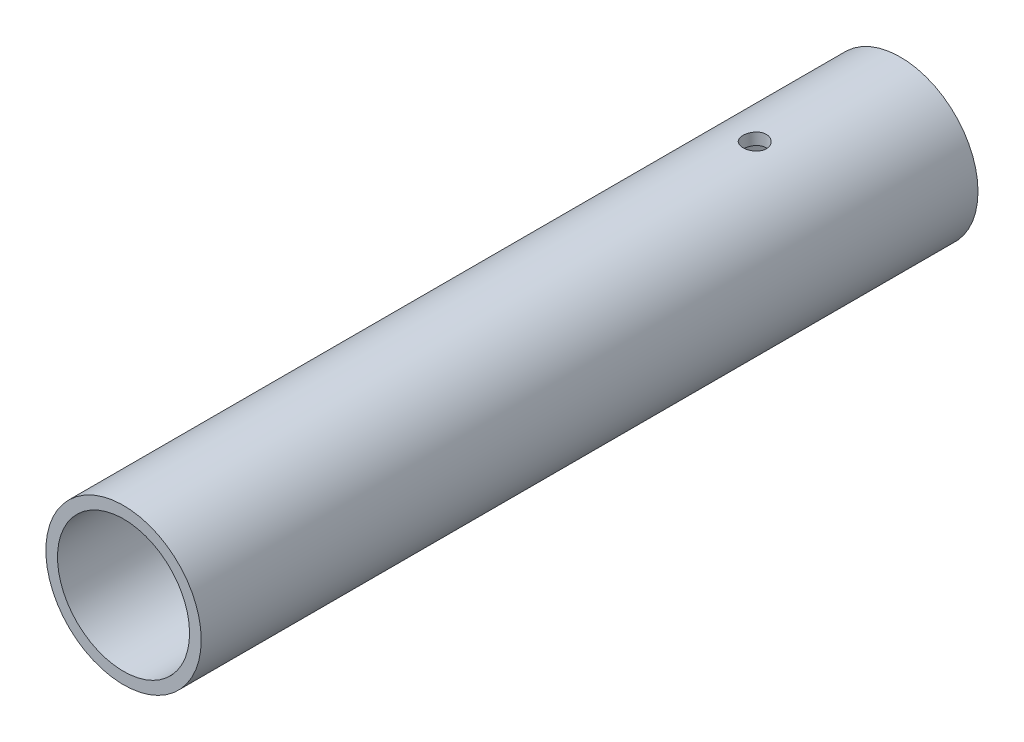
ISO-10303-21;
HEADER;
FILE_DESCRIPTION(('STEP AP214'),'2;1');
FILE_NAME('part.step','',(''),(''),'','','');
FILE_SCHEMA(('AUTOMOTIVE_DESIGN { 1 0 10303 214 1 1 1 1 }'));
ENDSEC;
DATA;
#1=APPLICATION_CONTEXT('core data for automotive mechanical design processes');
#2=APPLICATION_PROTOCOL_DEFINITION('international standard','automotive_design',2000,#1);
#3=PRODUCT_CONTEXT('',#1,'mechanical');
#4=PRODUCT('Part','Part','',(#3));
#5=PRODUCT_RELATED_PRODUCT_CATEGORY('part','',(#4));
#6=PRODUCT_DEFINITION_FORMATION('','',#4);
#7=PRODUCT_DEFINITION_CONTEXT('part definition',#1,'design');
#8=PRODUCT_DEFINITION('design','',#6,#7);
#9=PRODUCT_DEFINITION_SHAPE('','',#8);
#10=(LENGTH_UNIT() NAMED_UNIT(*) SI_UNIT(.MILLI.,.METRE.));
#11=(NAMED_UNIT(*) PLANE_ANGLE_UNIT() SI_UNIT($,.RADIAN.));
#12=(NAMED_UNIT(*) SI_UNIT($,.STERADIAN.) SOLID_ANGLE_UNIT());
#13=UNCERTAINTY_MEASURE_WITH_UNIT(LENGTH_MEASURE(1.E-05),#10,'distance_accuracy_value','');
#14=(GEOMETRIC_REPRESENTATION_CONTEXT(3) GLOBAL_UNCERTAINTY_ASSIGNED_CONTEXT((#13)) GLOBAL_UNIT_ASSIGNED_CONTEXT((#10,
#11,#12)) REPRESENTATION_CONTEXT('',''));
#15=CARTESIAN_POINT('',(0.,0.,0.));
#16=DIRECTION('',(0.,0.,1.));
#17=DIRECTION('',(1.,0.,0.));
#18=AXIS2_PLACEMENT_3D('',#15,#16,#17);
#19=CARTESIAN_POINT('',(0.,0.,100.));
#20=DIRECTION('',(0.,0.,1.));
#21=DIRECTION('',(1.,0.,0.));
#22=AXIS2_PLACEMENT_3D('',#19,#20,#21);
#23=PLANE('',#22);
#24=CARTESIAN_POINT('',(0.,0.,100.));
#25=DIRECTION('',(0.,0.,1.));
#26=DIRECTION('',(1.,0.,0.));
#27=AXIS2_PLACEMENT_3D('',#24,#25,#26);
#28=CIRCLE('',#27,20.);
#29=CARTESIAN_POINT('',(20.,0.,100.));
#30=VERTEX_POINT('',#29);
#31=EDGE_CURVE('E10',#30,#30,#28,.T.);
#32=ORIENTED_EDGE('',*,*,#31,.T.);
#33=EDGE_LOOP('',(#32));
#34=FACE_BOUND('',#33,.T.);
#35=CARTESIAN_POINT('',(0.,0.,100.));
#36=DIRECTION('',(0.,0.,1.));
#37=DIRECTION('',(1.,0.,0.));
#38=AXIS2_PLACEMENT_3D('',#35,#36,#37);
#39=CIRCLE('',#38,17.);
#40=CARTESIAN_POINT('',(17.,0.,100.));
#41=VERTEX_POINT('',#40);
#42=EDGE_CURVE('E58',#41,#41,#39,.T.);
#43=ORIENTED_EDGE('',*,*,#42,.F.);
#44=EDGE_LOOP('',(#43));
#45=FACE_BOUND('',#44,.T.);
#46=ADVANCED_FACE('F37',(#34,#45),#23,.T.);
#47=CARTESIAN_POINT('',(0.,0.,-100.));
#48=DIRECTION('',(0.,0.,1.));
#49=DIRECTION('',(1.,0.,0.));
#50=AXIS2_PLACEMENT_3D('',#47,#48,#49);
#51=PLANE('',#50);
#52=CARTESIAN_POINT('',(0.,0.,-100.));
#53=DIRECTION('',(0.,0.,1.));
#54=DIRECTION('',(1.,0.,0.));
#55=AXIS2_PLACEMENT_3D('',#52,#53,#54);
#56=CIRCLE('',#55,20.);
#57=CARTESIAN_POINT('',(20.,0.,-100.));
#58=VERTEX_POINT('',#57);
#59=EDGE_CURVE('E52',#58,#58,#56,.T.);
#60=ORIENTED_EDGE('',*,*,#59,.F.);
#61=EDGE_LOOP('',(#60));
#62=FACE_BOUND('',#61,.T.);
#63=CARTESIAN_POINT('',(0.,0.,-100.));
#64=DIRECTION('',(0.,0.,1.));
#65=DIRECTION('',(1.,0.,0.));
#66=AXIS2_PLACEMENT_3D('',#63,#64,#65);
#67=CIRCLE('',#66,17.);
#68=CARTESIAN_POINT('',(17.,0.,-100.));
#69=VERTEX_POINT('',#68);
#70=EDGE_CURVE('E61',#69,#69,#67,.T.);
#71=ORIENTED_EDGE('',*,*,#70,.T.);
#72=EDGE_LOOP('',(#71));
#73=FACE_BOUND('',#72,.T.);
#74=ADVANCED_FACE('F102',(#62,#73),#51,.F.);
#75=CARTESIAN_POINT('',(0.,0.,100.));
#76=DIRECTION('',(0.,0.,-1.));
#77=DIRECTION('',(-1.,0.,0.));
#78=AXIS2_PLACEMENT_3D('',#75,#76,#77);
#79=CYLINDRICAL_SURFACE('',#78,20.);
#80=CARTESIAN_POINT('',(0.,-20.,-59.5));
#81=CARTESIAN_POINT('',(0.167503088963284,-19.9999973154259,-59.5000069076305));
#82=CARTESIAN_POINT('',(0.335103370164264,-19.9978736507408,-59.5140760016813));
#83=CARTESIAN_POINT('',(0.665619255989826,-19.9896063194637,-59.5699663999655));
#84=CARTESIAN_POINT('',(0.828530137948457,-19.9834587387695,-59.6118147258898));
#85=CARTESIAN_POINT('',(1.14483617244372,-19.9678344243905,-59.7219850099352));
#86=CARTESIAN_POINT('',(1.2982384156536,-19.9583602074184,-59.7902869590119));
#87=CARTESIAN_POINT('',(1.59138085727051,-19.9371295182345,-59.9513767588337));
#88=CARTESIAN_POINT('',(1.73112294945038,-19.9253733630554,-60.0441612088347));
#89=CARTESIAN_POINT('',(1.99409343912425,-19.900783419829,-60.2523545298798));
#90=CARTESIAN_POINT('',(2.117199664451,-19.8879426778066,-60.3679169124164));
#91=CARTESIAN_POINT('',(2.34234981337897,-19.8626852226648,-60.6180553777877));
#92=CARTESIAN_POINT('',(2.44439252545871,-19.8502685339701,-60.752632553557));
#93=CARTESIAN_POINT('',(2.62499458999886,-19.8271975491745,-61.037801287045));
#94=CARTESIAN_POINT('',(2.7034357407441,-19.8165522395006,-61.1884684939627));
#95=CARTESIAN_POINT('',(2.83385264342112,-19.7983242261253,-61.5010256412908));
#96=CARTESIAN_POINT('',(2.88582983778326,-19.790741355509,-61.6629149694878));
#97=CARTESIAN_POINT('',(2.96146397597822,-19.7795651243735,-61.9920360837434));
#98=CARTESIAN_POINT('',(2.98533007281035,-19.775942314825,-62.159218786816));
#99=CARTESIAN_POINT('',(3.00471248067865,-19.7730069794116,-62.4952523319745));
#100=CARTESIAN_POINT('',(3.00023041947592,-19.7736942060629,-62.664103077725));
#101=CARTESIAN_POINT('',(2.96321466501575,-19.7792743670482,-62.9972021603883));
#102=CARTESIAN_POINT('',(2.93091391855501,-19.784132375231,-63.1614770529696));
#103=CARTESIAN_POINT('',(2.83954234807469,-19.7974521625273,-63.482248737743));
#104=CARTESIAN_POINT('',(2.78047076675625,-19.8059140435876,-63.6387453097615));
#105=CARTESIAN_POINT('',(2.63699207059473,-19.8255267109096,-63.9402267425657));
#106=CARTESIAN_POINT('',(2.55248628566396,-19.8366879353305,-64.0851639381848));
#107=CARTESIAN_POINT('',(2.3606082625791,-19.8604341514909,-64.3588891915639));
#108=CARTESIAN_POINT('',(2.25323452364956,-19.87301923665,-64.4876761885387));
#109=CARTESIAN_POINT('',(2.01738986156496,-19.8983494611242,-64.7267953214794));
#110=CARTESIAN_POINT('',(1.88871865928401,-19.9110949422563,-64.8369299805727));
#111=CARTESIAN_POINT('',(1.61461417978838,-19.9351929529692,-65.0340718690145));
#112=CARTESIAN_POINT('',(1.46918082917634,-19.9465454764502,-65.1210789970878));
#113=CARTESIAN_POINT('',(1.16550919642737,-19.9665903117079,-65.2695061729991));
#114=CARTESIAN_POINT('',(1.00726335567356,-19.9752810385085,-65.3309109836806));
#115=CARTESIAN_POINT('',(0.682546364974125,-19.9890098111414,-65.4262187793708));
#116=CARTESIAN_POINT('',(0.516075771905205,-19.9940481039093,-65.4601236236312));
#117=CARTESIAN_POINT('',(0.181339135287298,-19.9998716226774,-65.4992064596334));
#118=CARTESIAN_POINT('',(0.0131054637409462,-20.0006970418078,-65.5046559427586));
#119=CARTESIAN_POINT('',(-0.321873355324562,-19.9981112203045,-65.4873939893779));
#120=CARTESIAN_POINT('',(-0.488618548763752,-19.9947001108274,-65.4646834246638));
#121=CARTESIAN_POINT('',(-0.815064774862814,-19.9840493723067,-65.3919717996449));
#122=CARTESIAN_POINT('',(-0.974795926159673,-19.9768283041597,-65.3421030079383));
#123=CARTESIAN_POINT('',(-1.283629917286,-19.9593647131674,-65.2166300050765));
#124=CARTESIAN_POINT('',(-1.4327322575902,-19.9491220484313,-65.1410245853327));
#125=CARTESIAN_POINT('',(-1.71726995858385,-19.9266536493737,-64.9655875508723));
#126=CARTESIAN_POINT('',(-1.85259801978314,-19.9144140325349,-64.8655837199745));
#127=CARTESIAN_POINT('',(-2.10464734635542,-19.8893572602433,-64.6444283767425));
#128=CARTESIAN_POINT('',(-2.22136752958681,-19.8765400712573,-64.5232756353507));
#129=CARTESIAN_POINT('',(-2.43387569914391,-19.8516452860899,-64.262052933647));
#130=CARTESIAN_POINT('',(-2.52948169494843,-19.8395747203518,-64.1218341496105));
#131=CARTESIAN_POINT('',(-2.69578258541168,-19.8176643820981,-63.8271679189765));
#132=CARTESIAN_POINT('',(-2.76647815312872,-19.8078245493126,-63.6727208569571));
#133=CARTESIAN_POINT('',(-2.88066934647887,-19.7915406601729,-63.3545249327537));
#134=CARTESIAN_POINT('',(-2.92426074283271,-19.7850846601288,-63.1908110780575));
#135=CARTESIAN_POINT('',(-2.98331099003173,-19.776267645956,-62.8582819691298));
#136=CARTESIAN_POINT('',(-2.99877178366133,-19.7739063490354,-62.6894670680107));
#137=CARTESIAN_POINT('',(-3.0010757333888,-19.7735566522168,-62.3533418733684));
#138=CARTESIAN_POINT('',(-2.98820504334626,-19.77552452667,-62.1860335164862));
#139=CARTESIAN_POINT('',(-2.93482459088758,-19.7835164122235,-61.855989473353));
#140=CARTESIAN_POINT('',(-2.89431487277254,-19.7895404168223,-61.6932537797732));
#141=CARTESIAN_POINT('',(-2.7869074703733,-19.8049505222459,-61.3770538355314));
#142=CARTESIAN_POINT('',(-2.72002978648628,-19.8143340743215,-61.2235826591331));
#143=CARTESIAN_POINT('',(-2.56181335284618,-19.835409091154,-60.9299927323952));
#144=CARTESIAN_POINT('',(-2.47047377483004,-19.8471006340545,-60.7898744343927));
#145=CARTESIAN_POINT('',(-2.26488675318328,-19.8716148672988,-60.5255138840497));
#146=CARTESIAN_POINT('',(-2.15042738079611,-19.8844473576393,-60.4014373335059));
#147=CARTESIAN_POINT('',(-1.90229768216567,-19.9097157765327,-60.1741508904244));
#148=CARTESIAN_POINT('',(-1.76862289670188,-19.9221516122152,-60.0709458548477));
#149=CARTESIAN_POINT('',(-1.48499141508744,-19.9453037158104,-59.8878246467853));
#150=CARTESIAN_POINT('',(-1.33494915352952,-19.9560101425764,-59.8080397815705));
#151=CARTESIAN_POINT('',(-1.02350374049744,-19.9744005760592,-59.6749229664839));
#152=CARTESIAN_POINT('',(-0.86211255419341,-19.9820877113151,-59.6215636198926));
#153=CARTESIAN_POINT('',(-0.583331455778659,-19.9918187852301,-59.5549173145798));
#154=CARTESIAN_POINT('',(-0.467662266990557,-19.9948709835911,-59.5343547969224));
#155=CARTESIAN_POINT('',(-0.23467794320025,-19.9989625189579,-59.5068938045747));
#156=CARTESIAN_POINT('',(-0.117362828668834,-20.0000018809755,-59.4999951600949));
#157=CARTESIAN_POINT('',(0.,-20.,-59.5));
#158=B_SPLINE_CURVE_WITH_KNOTS('',3,(#80,#81,#82,#83,#84,#85,#86,#87,#88,#89,#90,#91,#92,#93,
#94,#95,#96,#97,#98,#99,#100,#101,#102,#103,#104,#105,#106,#107,#108,#109,#110,#111,#112,#113,
#114,#115,#116,#117,#118,#119,#120,#121,#122,#123,#124,#125,#126,#127,#128,#129,#130,#131,#132,
#133,#134,#135,#136,#137,#138,#139,#140,#141,#142,#143,#144,#145,#146,#147,#148,#149,#150,#151,
#152,#153,#154,#155,#156,#157),.UNSPECIFIED.,.T.,.F.,(4,2,2,2,2,2,2,2,2,2,2,2,2,2,2,2,2,2,2,2,2,
2,2,2,2,2,2,2,2,2,2,2,2,2,2,2,2,2,4),(0.,0.502080410063326,1.0046499258583,1.50684004716647,
2.0089604483952,2.51458832273687,3.0202452714516,3.5283940479075,4.03651512451011,
4.54083129211848,5.04511850197965,5.54522354391492,6.04534273380722,6.54742766952317,
7.04954556617068,7.55668582510817,8.06382830477336,8.57127217969749,9.07868174386802,
9.5812411708851,10.0837850398231,10.583902979319,11.0840444075255,11.5878237607382,
12.0916324005726,12.5996273316934,13.1076085361766,13.6137844691434,14.1199254427435,
14.6209777652213,15.1220292845913,15.6227014796829,16.1233906293376,16.6288965993144,
17.1345200693747,17.6429264676947,18.1508046652288,18.5025970395762,18.8543850424658),.UNSPECIFIED.);
#159=CARTESIAN_POINT('',(0.,-20.,-59.5));
#160=VERTEX_POINT('',#159);
#161=EDGE_CURVE('E88',#160,#160,#158,.T.);
#162=ORIENTED_EDGE('',*,*,#161,.T.);
#163=EDGE_LOOP('',(#162));
#164=FACE_BOUND('',#163,.T.);
#165=CARTESIAN_POINT('',(0.,20.,-59.5));
#166=CARTESIAN_POINT('',(-0.167503088963284,19.9999973154259,-59.5000069076305));
#167=CARTESIAN_POINT('',(-0.335103370164264,19.9978736507408,-59.5140760016813));
#168=CARTESIAN_POINT('',(-0.665619255989826,19.9896063194637,-59.5699663999655));
#169=CARTESIAN_POINT('',(-0.828530137948457,19.9834587387695,-59.6118147258898));
#170=CARTESIAN_POINT('',(-1.14483617244372,19.9678344243905,-59.7219850099352));
#171=CARTESIAN_POINT('',(-1.2982384156536,19.9583602074184,-59.7902869590119));
#172=CARTESIAN_POINT('',(-1.59138085727051,19.9371295182345,-59.9513767588337));
#173=CARTESIAN_POINT('',(-1.73112294945038,19.9253733630554,-60.0441612088347));
#174=CARTESIAN_POINT('',(-1.99409343912425,19.900783419829,-60.2523545298798));
#175=CARTESIAN_POINT('',(-2.117199664451,19.8879426778066,-60.3679169124164));
#176=CARTESIAN_POINT('',(-2.34234981337897,19.8626852226648,-60.6180553777877));
#177=CARTESIAN_POINT('',(-2.44439252545871,19.8502685339701,-60.752632553557));
#178=CARTESIAN_POINT('',(-2.62499458999886,19.8271975491745,-61.037801287045));
#179=CARTESIAN_POINT('',(-2.7034357407441,19.8165522395006,-61.1884684939627));
#180=CARTESIAN_POINT('',(-2.83385264342112,19.7983242261253,-61.5010256412908));
#181=CARTESIAN_POINT('',(-2.88582983778326,19.790741355509,-61.6629149694878));
#182=CARTESIAN_POINT('',(-2.96146397597822,19.7795651243735,-61.9920360837434));
#183=CARTESIAN_POINT('',(-2.98533007281035,19.775942314825,-62.159218786816));
#184=CARTESIAN_POINT('',(-3.00471248067865,19.7730069794116,-62.4952523319745));
#185=CARTESIAN_POINT('',(-3.00023041947592,19.7736942060629,-62.664103077725));
#186=CARTESIAN_POINT('',(-2.96321466501575,19.7792743670482,-62.9972021603883));
#187=CARTESIAN_POINT('',(-2.93091391855501,19.784132375231,-63.1614770529696));
#188=CARTESIAN_POINT('',(-2.83954234807469,19.7974521625273,-63.482248737743));
#189=CARTESIAN_POINT('',(-2.78047076675625,19.8059140435876,-63.6387453097615));
#190=CARTESIAN_POINT('',(-2.63699207059473,19.8255267109096,-63.9402267425657));
#191=CARTESIAN_POINT('',(-2.55248628566396,19.8366879353305,-64.0851639381848));
#192=CARTESIAN_POINT('',(-2.3606082625791,19.8604341514909,-64.3588891915639));
#193=CARTESIAN_POINT('',(-2.25323452364956,19.87301923665,-64.4876761885387));
#194=CARTESIAN_POINT('',(-2.01738986156496,19.8983494611242,-64.7267953214794));
#195=CARTESIAN_POINT('',(-1.88871865928401,19.9110949422563,-64.8369299805727));
#196=CARTESIAN_POINT('',(-1.61461417978838,19.9351929529692,-65.0340718690145));
#197=CARTESIAN_POINT('',(-1.46918082917634,19.9465454764502,-65.1210789970878));
#198=CARTESIAN_POINT('',(-1.16550919642737,19.9665903117079,-65.2695061729991));
#199=CARTESIAN_POINT('',(-1.00726335567356,19.9752810385085,-65.3309109836806));
#200=CARTESIAN_POINT('',(-0.682546364974125,19.9890098111414,-65.4262187793708));
#201=CARTESIAN_POINT('',(-0.516075771905205,19.9940481039093,-65.4601236236312));
#202=CARTESIAN_POINT('',(-0.181339135287298,19.9998716226774,-65.4992064596334));
#203=CARTESIAN_POINT('',(-0.0131054637409462,20.0006970418078,-65.5046559427586));
#204=CARTESIAN_POINT('',(0.321873355324562,19.9981112203045,-65.4873939893779));
#205=CARTESIAN_POINT('',(0.488618548763752,19.9947001108274,-65.4646834246638));
#206=CARTESIAN_POINT('',(0.815064774862814,19.9840493723067,-65.3919717996449));
#207=CARTESIAN_POINT('',(0.974795926159673,19.9768283041597,-65.3421030079383));
#208=CARTESIAN_POINT('',(1.283629917286,19.9593647131674,-65.2166300050765));
#209=CARTESIAN_POINT('',(1.4327322575902,19.9491220484313,-65.1410245853327));
#210=CARTESIAN_POINT('',(1.71726995858385,19.9266536493737,-64.9655875508723));
#211=CARTESIAN_POINT('',(1.85259801978314,19.9144140325349,-64.8655837199745));
#212=CARTESIAN_POINT('',(2.10464734635542,19.8893572602433,-64.6444283767425));
#213=CARTESIAN_POINT('',(2.22136752958681,19.8765400712573,-64.5232756353507));
#214=CARTESIAN_POINT('',(2.43387569914391,19.8516452860899,-64.262052933647));
#215=CARTESIAN_POINT('',(2.52948169494843,19.8395747203518,-64.1218341496105));
#216=CARTESIAN_POINT('',(2.69578258541168,19.8176643820981,-63.8271679189765));
#217=CARTESIAN_POINT('',(2.76647815312872,19.8078245493126,-63.6727208569571));
#218=CARTESIAN_POINT('',(2.88066934647887,19.7915406601729,-63.3545249327537));
#219=CARTESIAN_POINT('',(2.92426074283271,19.7850846601288,-63.1908110780575));
#220=CARTESIAN_POINT('',(2.98331099003173,19.776267645956,-62.8582819691298));
#221=CARTESIAN_POINT('',(2.99877178366133,19.7739063490354,-62.6894670680107));
#222=CARTESIAN_POINT('',(3.0010757333888,19.7735566522168,-62.3533418733684));
#223=CARTESIAN_POINT('',(2.98820504334626,19.77552452667,-62.1860335164862));
#224=CARTESIAN_POINT('',(2.93482459088758,19.7835164122235,-61.855989473353));
#225=CARTESIAN_POINT('',(2.89431487277254,19.7895404168223,-61.6932537797732));
#226=CARTESIAN_POINT('',(2.7869074703733,19.8049505222459,-61.3770538355314));
#227=CARTESIAN_POINT('',(2.72002978648628,19.8143340743215,-61.2235826591331));
#228=CARTESIAN_POINT('',(2.56181335284618,19.835409091154,-60.9299927323952));
#229=CARTESIAN_POINT('',(2.47047377483004,19.8471006340545,-60.7898744343927));
#230=CARTESIAN_POINT('',(2.26488675318328,19.8716148672988,-60.5255138840497));
#231=CARTESIAN_POINT('',(2.15042738079611,19.8844473576393,-60.4014373335059));
#232=CARTESIAN_POINT('',(1.90229768216567,19.9097157765327,-60.1741508904244));
#233=CARTESIAN_POINT('',(1.76862289670188,19.9221516122152,-60.0709458548477));
#234=CARTESIAN_POINT('',(1.48499141508744,19.9453037158104,-59.8878246467853));
#235=CARTESIAN_POINT('',(1.33494915352952,19.9560101425764,-59.8080397815705));
#236=CARTESIAN_POINT('',(1.02350374049744,19.9744005760592,-59.6749229664839));
#237=CARTESIAN_POINT('',(0.86211255419341,19.9820877113151,-59.6215636198926));
#238=CARTESIAN_POINT('',(0.583331455778659,19.9918187852301,-59.5549173145798));
#239=CARTESIAN_POINT('',(0.467662266990557,19.9948709835911,-59.5343547969224));
#240=CARTESIAN_POINT('',(0.23467794320025,19.9989625189579,-59.5068938045747));
#241=CARTESIAN_POINT('',(0.117362828668834,20.0000018809755,-59.4999951600949));
#242=CARTESIAN_POINT('',(0.,20.,-59.5));
#243=B_SPLINE_CURVE_WITH_KNOTS('',3,(#165,#166,#167,#168,#169,#170,#171,#172,#173,#174,#175,
#176,#177,#178,#179,#180,#181,#182,#183,#184,#185,#186,#187,#188,#189,#190,#191,#192,#193,#194,
#195,#196,#197,#198,#199,#200,#201,#202,#203,#204,#205,#206,#207,#208,#209,#210,#211,#212,#213,
#214,#215,#216,#217,#218,#219,#220,#221,#222,#223,#224,#225,#226,#227,#228,#229,#230,#231,#232,
#233,#234,#235,#236,#237,#238,#239,#240,#241,#242),.UNSPECIFIED.,.T.,.F.,(4,2,2,2,2,2,2,2,2,2,2,
2,2,2,2,2,2,2,2,2,2,2,2,2,2,2,2,2,2,2,2,2,2,2,2,2,2,2,4),(0.,0.502080410063326,1.0046499258583,
1.50684004716647,2.0089604483952,2.51458832273687,3.0202452714516,3.5283940479075,
4.03651512451011,4.54083129211848,5.04511850197965,5.54522354391492,6.04534273380722,
6.54742766952317,7.04954556617068,7.55668582510817,8.06382830477336,8.57127217969749,
9.07868174386802,9.5812411708851,10.0837850398231,10.583902979319,11.0840444075255,
11.5878237607382,12.0916324005726,12.5996273316934,13.1076085361766,13.6137844691434,
14.1199254427435,14.6209777652213,15.1220292845913,15.6227014796829,16.1233906293376,
16.6288965993144,17.1345200693747,17.6429264676947,18.1508046652288,18.5025970395762,
18.8543850424658),.UNSPECIFIED.);
#244=CARTESIAN_POINT('',(0.,20.,-59.5));
#245=VERTEX_POINT('',#244);
#246=EDGE_CURVE('E82',#245,#245,#243,.T.);
#247=ORIENTED_EDGE('',*,*,#246,.T.);
#248=EDGE_LOOP('',(#247));
#249=FACE_BOUND('',#248,.T.);
#250=ORIENTED_EDGE('',*,*,#31,.F.);
#251=EDGE_LOOP('',(#250));
#252=FACE_BOUND('',#251,.T.);
#253=ORIENTED_EDGE('',*,*,#59,.T.);
#254=EDGE_LOOP('',(#253));
#255=FACE_BOUND('',#254,.T.);
#256=ADVANCED_FACE('F39',(#164,#249,#252,#255),#79,.T.);
#257=CARTESIAN_POINT('',(0.,0.,100.));
#258=DIRECTION('',(0.,0.,-1.));
#259=DIRECTION('',(-1.,0.,0.));
#260=AXIS2_PLACEMENT_3D('',#257,#258,#259);
#261=CYLINDRICAL_SURFACE('',#260,17.);
#262=CARTESIAN_POINT('',(0.,-17.,-59.5));
#263=CARTESIAN_POINT('',(0.167120414623367,-16.9999970493162,-59.5000065642618));
#264=CARTESIAN_POINT('',(0.334328341798332,-16.9975100887539,-59.5140117998008));
#265=CARTESIAN_POINT('',(0.66404440934584,-16.9878286909565,-59.5696335862835));
#266=CARTESIAN_POINT('',(0.826548257087076,-16.9806300873321,-59.6112745752958));
#267=CARTESIAN_POINT('',(1.14203902010652,-16.9623318361036,-59.7208630265866));
#268=CARTESIAN_POINT('',(1.29503396192421,-16.9512355326941,-59.7887879425313));
#269=CARTESIAN_POINT('',(1.58743860111944,-16.9263581232614,-59.9489547545507));
#270=CARTESIAN_POINT('',(1.72684964170123,-16.9125772830958,-60.0411942430012));
#271=CARTESIAN_POINT('',(1.98963303309909,-16.8836911294908,-60.2484173416945));
#272=CARTESIAN_POINT('',(2.11283950672574,-16.8685744245722,-60.3636097380495));
#273=CARTESIAN_POINT('',(2.3382825301274,-16.8388062603207,-60.6130194595813));
#274=CARTESIAN_POINT('',(2.44051767537455,-16.8241548322048,-60.7472380579963));
#275=CARTESIAN_POINT('',(2.62179230448469,-16.7968656534976,-61.0320447893425));
#276=CARTESIAN_POINT('',(2.70066559457707,-16.7842426097831,-61.1827402343762));
#277=CARTESIAN_POINT('',(2.83191430540635,-16.762598667562,-61.4955018860934));
#278=CARTESIAN_POINT('',(2.88429174011602,-16.753577495285,-61.6575672274745));
#279=CARTESIAN_POINT('',(2.9605348131781,-16.7402727224387,-61.9867021137941));
#280=CARTESIAN_POINT('',(2.98468818942974,-16.7359413444703,-62.1537030365058));
#281=CARTESIAN_POINT('',(3.00469010972316,-16.7323622825846,-62.4894390221035));
#282=CARTESIAN_POINT('',(3.00054089987604,-16.7331141952541,-62.658173946317));
#283=CARTESIAN_POINT('',(2.96428931758404,-16.7395731906525,-62.9905202650881));
#284=CARTESIAN_POINT('',(2.93251197235851,-16.7452226546096,-63.1541683967547));
#285=CARTESIAN_POINT('',(2.84241705746447,-16.7607498689153,-63.47377346362));
#286=CARTESIAN_POINT('',(2.78409847761282,-16.7706277802014,-63.6297301058233));
#287=CARTESIAN_POINT('',(2.64225236290752,-16.7935602245701,-63.9304881204053));
#288=CARTESIAN_POINT('',(2.55859156600466,-16.8066314777635,-64.0752253151686));
#289=CARTESIAN_POINT('',(2.36853028324904,-16.8344664575681,-64.348730041368));
#290=CARTESIAN_POINT('',(2.26212774561367,-16.8492303368338,-64.4774961302174));
#291=CARTESIAN_POINT('',(2.02784088805694,-16.8790392732219,-64.7172832931603));
#292=CARTESIAN_POINT('',(1.89967808645437,-16.8940853830876,-64.8280323225915));
#293=CARTESIAN_POINT('',(1.62644603409548,-16.9225739536277,-65.0264963555073));
#294=CARTESIAN_POINT('',(1.48137664851593,-16.9360164015118,-65.1142111752851));
#295=CARTESIAN_POINT('',(1.17818086699528,-16.959805668293,-65.2641485973373));
#296=CARTESIAN_POINT('',(1.02004136259565,-16.9701493300429,-65.3263452244933));
#297=CARTESIAN_POINT('',(0.695336964761055,-16.9865507040231,-65.4232179932838));
#298=CARTESIAN_POINT('',(0.528772864268631,-16.9926088188176,-65.4578967198585));
#299=CARTESIAN_POINT('',(0.194290223238338,-16.9997018515363,-65.4983759971673));
#300=CARTESIAN_POINT('',(0.0264181687230149,-17.0008016686724,-65.5045496768119));
#301=CARTESIAN_POINT('',(-0.307960542503083,-16.9980326332848,-65.4888411741129));
#302=CARTESIAN_POINT('',(-0.474467258041028,-16.9941639959766,-65.4669602069958));
#303=CARTESIAN_POINT('',(-0.800222097080607,-16.9819330139172,-65.3960738453198));
#304=CARTESIAN_POINT('',(-0.959512085915615,-16.9736015932199,-65.3472550423423));
#305=CARTESIAN_POINT('',(-1.26764666616356,-16.9533753410855,-65.2240790791764));
#306=CARTESIAN_POINT('',(-1.41649061275955,-16.9414802899098,-65.149720344117));
#307=CARTESIAN_POINT('',(-1.70111583870657,-16.9152846538862,-64.976733855727));
#308=CARTESIAN_POINT('',(-1.83675476175314,-16.9009616307937,-64.8778753400647));
#309=CARTESIAN_POINT('',(-2.08965150753396,-16.8715617250843,-64.6590105753199));
#310=CARTESIAN_POINT('',(-2.20690782088868,-16.8564847806975,-64.5390025913903));
#311=CARTESIAN_POINT('',(-2.42110991503517,-16.8270639355927,-64.2795646222966));
#312=CARTESIAN_POINT('',(-2.51780240659899,-16.8127306567567,-64.1399241124812));
#313=CARTESIAN_POINT('',(-2.68635775298319,-16.7866252456887,-63.8461631323342));
#314=CARTESIAN_POINT('',(-2.75822146077018,-16.7748530254793,-63.6920431596605));
#315=CARTESIAN_POINT('',(-2.87470940472998,-16.755284011476,-63.3743765636783));
#316=CARTESIAN_POINT('',(-2.91945514875682,-16.7474695105614,-63.2108756380149));
#317=CARTESIAN_POINT('',(-2.98081609397045,-16.7366580626152,-62.8785275304503));
#318=CARTESIAN_POINT('',(-2.9974340690614,-16.7336606405344,-62.7096808774072));
#319=CARTESIAN_POINT('',(-3.00198328302213,-16.732844876911,-62.3739669504046));
#320=CARTESIAN_POINT('',(-2.99031356922352,-16.7349544911349,-62.2071051263936));
#321=CARTESIAN_POINT('',(-2.93948645747327,-16.7439563588915,-61.8777601057159));
#322=CARTESIAN_POINT('',(-2.90032918115828,-16.7508485912603,-61.7152768896765));
#323=CARTESIAN_POINT('',(-2.79579853334057,-16.7686103711706,-61.3994833090954));
#324=CARTESIAN_POINT('',(-2.73046357819502,-16.7794740884275,-61.2461598795811));
#325=CARTESIAN_POINT('',(-2.5754743045794,-16.8039596731212,-60.9525862610361));
#326=CARTESIAN_POINT('',(-2.48581854313338,-16.8175817041991,-60.8123368483623));
#327=CARTESIAN_POINT('',(-2.28332523329501,-16.8462753043112,-60.5468840468029));
#328=CARTESIAN_POINT('',(-2.170195513253,-16.8613637275988,-60.4219053197566));
#329=CARTESIAN_POINT('',(-1.92457896679826,-16.8911594661286,-60.1925705430325));
#330=CARTESIAN_POINT('',(-1.79208769191901,-16.9058666928712,-60.0882192456635));
#331=CARTESIAN_POINT('',(-1.51026879729739,-16.933377426209,-59.9023453121442));
#332=CARTESIAN_POINT('',(-1.36081728726057,-16.9461650982979,-59.8210081280582));
#333=CARTESIAN_POINT('',(-1.0502005802674,-16.9682417671998,-59.6847227734754));
#334=CARTESIAN_POINT('',(-0.889046924195101,-16.9775341566894,-59.6297489991537));
#335=CARTESIAN_POINT('',(-0.606111881089922,-16.9896059046402,-59.5593338174227));
#336=CARTESIAN_POINT('',(-0.486017062005792,-16.9934823235844,-59.5371203472081));
#337=CARTESIAN_POINT('',(-0.243963683154459,-16.9986804218506,-59.5074511953484));
#338=CARTESIAN_POINT('',(-0.122005162071693,-17.0000021541273,-59.4999952078037));
#339=CARTESIAN_POINT('',(0.,-17.,-59.5));
#340=B_SPLINE_CURVE_WITH_KNOTS('',3,(#262,#263,#264,#265,#266,#267,#268,#269,#270,#271,#272,
#273,#274,#275,#276,#277,#278,#279,#280,#281,#282,#283,#284,#285,#286,#287,#288,#289,#290,#291,
#292,#293,#294,#295,#296,#297,#298,#299,#300,#301,#302,#303,#304,#305,#306,#307,#308,#309,#310,
#311,#312,#313,#314,#315,#316,#317,#318,#319,#320,#321,#322,#323,#324,#325,#326,#327,#328,#329,
#330,#331,#332,#333,#334,#335,#336,#337,#338,#339),.UNSPECIFIED.,.T.,.F.,(4,2,2,2,2,2,2,2,2,2,2,
2,2,2,2,2,2,2,2,2,2,2,2,2,2,2,2,2,2,2,2,2,2,2,2,2,2,2,4),(0.,0.500915182530478,1.00227391148265,
1.50320352524182,2.00408355566979,2.50974680469441,3.01544390881807,3.52465654683849,
4.03383047334995,4.53776690343533,5.04166334127284,5.53971076807054,6.03777715258472,
6.53850947594504,7.03928699496107,7.54703729775122,8.05479164992364,8.56306157356244,
9.07128374635971,9.57283410745711,10.0743627439289,10.5724602518254,11.0705884794651,
11.5735998347881,12.0766524703134,12.5855821971045,13.0944944384142,13.6011091974613,
14.1076739922653,14.6071344918562,15.1065927812723,15.6053207729566,16.104078361109,
16.6094625448665,17.1149630276323,17.6244279017032,18.133396982566,18.4990944050425,
18.8647842471035),.UNSPECIFIED.);
#341=CARTESIAN_POINT('',(0.,-17.,-59.5));
#342=VERTEX_POINT('',#341);
#343=EDGE_CURVE('E42',#342,#342,#340,.T.);
#344=ORIENTED_EDGE('',*,*,#343,.F.);
#345=EDGE_LOOP('',(#344));
#346=FACE_BOUND('',#345,.T.);
#347=CARTESIAN_POINT('',(0.,17.,-59.5));
#348=CARTESIAN_POINT('',(-0.167120414623367,16.9999970493162,-59.5000065642618));
#349=CARTESIAN_POINT('',(-0.334328341798332,16.9975100887539,-59.5140117998008));
#350=CARTESIAN_POINT('',(-0.66404440934584,16.9878286909565,-59.5696335862835));
#351=CARTESIAN_POINT('',(-0.826548257087076,16.9806300873321,-59.6112745752958));
#352=CARTESIAN_POINT('',(-1.14203902010652,16.9623318361036,-59.7208630265866));
#353=CARTESIAN_POINT('',(-1.29503396192421,16.9512355326941,-59.7887879425313));
#354=CARTESIAN_POINT('',(-1.58743860111944,16.9263581232614,-59.9489547545507));
#355=CARTESIAN_POINT('',(-1.72684964170123,16.9125772830958,-60.0411942430012));
#356=CARTESIAN_POINT('',(-1.98963303309909,16.8836911294908,-60.2484173416945));
#357=CARTESIAN_POINT('',(-2.11283950672574,16.8685744245722,-60.3636097380495));
#358=CARTESIAN_POINT('',(-2.3382825301274,16.8388062603207,-60.6130194595813));
#359=CARTESIAN_POINT('',(-2.44051767537455,16.8241548322048,-60.7472380579963));
#360=CARTESIAN_POINT('',(-2.62179230448469,16.7968656534976,-61.0320447893425));
#361=CARTESIAN_POINT('',(-2.70066559457707,16.7842426097831,-61.1827402343762));
#362=CARTESIAN_POINT('',(-2.83191430540635,16.762598667562,-61.4955018860934));
#363=CARTESIAN_POINT('',(-2.88429174011602,16.753577495285,-61.6575672274745));
#364=CARTESIAN_POINT('',(-2.9605348131781,16.7402727224387,-61.9867021137941));
#365=CARTESIAN_POINT('',(-2.98468818942974,16.7359413444703,-62.1537030365058));
#366=CARTESIAN_POINT('',(-3.00469010972316,16.7323622825846,-62.4894390221035));
#367=CARTESIAN_POINT('',(-3.00054089987604,16.7331141952541,-62.658173946317));
#368=CARTESIAN_POINT('',(-2.96428931758404,16.7395731906525,-62.9905202650881));
#369=CARTESIAN_POINT('',(-2.93251197235851,16.7452226546096,-63.1541683967547));
#370=CARTESIAN_POINT('',(-2.84241705746447,16.7607498689153,-63.47377346362));
#371=CARTESIAN_POINT('',(-2.78409847761282,16.7706277802014,-63.6297301058233));
#372=CARTESIAN_POINT('',(-2.64225236290752,16.7935602245701,-63.9304881204053));
#373=CARTESIAN_POINT('',(-2.55859156600466,16.8066314777635,-64.0752253151686));
#374=CARTESIAN_POINT('',(-2.36853028324904,16.8344664575681,-64.348730041368));
#375=CARTESIAN_POINT('',(-2.26212774561367,16.8492303368338,-64.4774961302174));
#376=CARTESIAN_POINT('',(-2.02784088805694,16.8790392732219,-64.7172832931603));
#377=CARTESIAN_POINT('',(-1.89967808645437,16.8940853830876,-64.8280323225915));
#378=CARTESIAN_POINT('',(-1.62644603409548,16.9225739536277,-65.0264963555073));
#379=CARTESIAN_POINT('',(-1.48137664851593,16.9360164015118,-65.1142111752851));
#380=CARTESIAN_POINT('',(-1.17818086699528,16.959805668293,-65.2641485973373));
#381=CARTESIAN_POINT('',(-1.02004136259565,16.9701493300429,-65.3263452244933));
#382=CARTESIAN_POINT('',(-0.695336964761055,16.9865507040231,-65.4232179932838));
#383=CARTESIAN_POINT('',(-0.528772864268631,16.9926088188176,-65.4578967198585));
#384=CARTESIAN_POINT('',(-0.194290223238338,16.9997018515363,-65.4983759971673));
#385=CARTESIAN_POINT('',(-0.0264181687230149,17.0008016686724,-65.5045496768119));
#386=CARTESIAN_POINT('',(0.307960542503083,16.9980326332848,-65.4888411741129));
#387=CARTESIAN_POINT('',(0.474467258041028,16.9941639959766,-65.4669602069958));
#388=CARTESIAN_POINT('',(0.800222097080607,16.9819330139172,-65.3960738453198));
#389=CARTESIAN_POINT('',(0.959512085915615,16.9736015932199,-65.3472550423423));
#390=CARTESIAN_POINT('',(1.26764666616356,16.9533753410855,-65.2240790791764));
#391=CARTESIAN_POINT('',(1.41649061275955,16.9414802899098,-65.149720344117));
#392=CARTESIAN_POINT('',(1.70111583870657,16.9152846538862,-64.976733855727));
#393=CARTESIAN_POINT('',(1.83675476175314,16.9009616307937,-64.8778753400647));
#394=CARTESIAN_POINT('',(2.08965150753396,16.8715617250843,-64.6590105753199));
#395=CARTESIAN_POINT('',(2.20690782088868,16.8564847806975,-64.5390025913903));
#396=CARTESIAN_POINT('',(2.42110991503517,16.8270639355927,-64.2795646222966));
#397=CARTESIAN_POINT('',(2.51780240659899,16.8127306567567,-64.1399241124812));
#398=CARTESIAN_POINT('',(2.68635775298319,16.7866252456887,-63.8461631323342));
#399=CARTESIAN_POINT('',(2.75822146077018,16.7748530254793,-63.6920431596605));
#400=CARTESIAN_POINT('',(2.87470940472998,16.755284011476,-63.3743765636783));
#401=CARTESIAN_POINT('',(2.91945514875682,16.7474695105614,-63.2108756380149));
#402=CARTESIAN_POINT('',(2.98081609397045,16.7366580626152,-62.8785275304503));
#403=CARTESIAN_POINT('',(2.9974340690614,16.7336606405344,-62.7096808774072));
#404=CARTESIAN_POINT('',(3.00198328302213,16.732844876911,-62.3739669504046));
#405=CARTESIAN_POINT('',(2.99031356922352,16.7349544911349,-62.2071051263936));
#406=CARTESIAN_POINT('',(2.93948645747327,16.7439563588915,-61.8777601057159));
#407=CARTESIAN_POINT('',(2.90032918115828,16.7508485912603,-61.7152768896765));
#408=CARTESIAN_POINT('',(2.79579853334057,16.7686103711706,-61.3994833090954));
#409=CARTESIAN_POINT('',(2.73046357819502,16.7794740884275,-61.2461598795811));
#410=CARTESIAN_POINT('',(2.5754743045794,16.8039596731212,-60.9525862610361));
#411=CARTESIAN_POINT('',(2.48581854313338,16.8175817041991,-60.8123368483623));
#412=CARTESIAN_POINT('',(2.28332523329501,16.8462753043112,-60.5468840468029));
#413=CARTESIAN_POINT('',(2.170195513253,16.8613637275988,-60.4219053197566));
#414=CARTESIAN_POINT('',(1.92457896679826,16.8911594661286,-60.1925705430325));
#415=CARTESIAN_POINT('',(1.79208769191901,16.9058666928712,-60.0882192456635));
#416=CARTESIAN_POINT('',(1.51026879729739,16.933377426209,-59.9023453121442));
#417=CARTESIAN_POINT('',(1.36081728726057,16.9461650982979,-59.8210081280582));
#418=CARTESIAN_POINT('',(1.0502005802674,16.9682417671998,-59.6847227734754));
#419=CARTESIAN_POINT('',(0.889046924195101,16.9775341566894,-59.6297489991537));
#420=CARTESIAN_POINT('',(0.606111881089922,16.9896059046402,-59.5593338174227));
#421=CARTESIAN_POINT('',(0.486017062005792,16.9934823235844,-59.5371203472081));
#422=CARTESIAN_POINT('',(0.243963683154459,16.9986804218506,-59.5074511953484));
#423=CARTESIAN_POINT('',(0.122005162071693,17.0000021541273,-59.4999952078037));
#424=CARTESIAN_POINT('',(0.,17.,-59.5));
#425=B_SPLINE_CURVE_WITH_KNOTS('',3,(#347,#348,#349,#350,#351,#352,#353,#354,#355,#356,#357,
#358,#359,#360,#361,#362,#363,#364,#365,#366,#367,#368,#369,#370,#371,#372,#373,#374,#375,#376,
#377,#378,#379,#380,#381,#382,#383,#384,#385,#386,#387,#388,#389,#390,#391,#392,#393,#394,#395,
#396,#397,#398,#399,#400,#401,#402,#403,#404,#405,#406,#407,#408,#409,#410,#411,#412,#413,#414,
#415,#416,#417,#418,#419,#420,#421,#422,#423,#424),.UNSPECIFIED.,.T.,.F.,(4,2,2,2,2,2,2,2,2,2,2,
2,2,2,2,2,2,2,2,2,2,2,2,2,2,2,2,2,2,2,2,2,2,2,2,2,2,2,4),(0.,0.500915182530478,1.00227391148265,
1.50320352524182,2.00408355566979,2.50974680469441,3.01544390881807,3.52465654683849,
4.03383047334995,4.53776690343533,5.04166334127284,5.53971076807054,6.03777715258472,
6.53850947594504,7.03928699496107,7.54703729775122,8.05479164992364,8.56306157356244,
9.07128374635971,9.57283410745711,10.0743627439289,10.5724602518254,11.0705884794651,
11.5735998347881,12.0766524703134,12.5855821971045,13.0944944384142,13.6011091974613,
14.1076739922653,14.6071344918562,15.1065927812723,15.6053207729566,16.104078361109,
16.6094625448665,17.1149630276323,17.6244279017032,18.133396982566,18.4990944050425,
18.8647842471035),.UNSPECIFIED.);
#426=CARTESIAN_POINT('',(0.,17.,-59.5));
#427=VERTEX_POINT('',#426);
#428=EDGE_CURVE('E63',#427,#427,#425,.T.);
#429=ORIENTED_EDGE('',*,*,#428,.F.);
#430=EDGE_LOOP('',(#429));
#431=FACE_BOUND('',#430,.T.);
#432=ORIENTED_EDGE('',*,*,#42,.T.);
#433=EDGE_LOOP('',(#432));
#434=FACE_BOUND('',#433,.T.);
#435=ORIENTED_EDGE('',*,*,#70,.F.);
#436=EDGE_LOOP('',(#435));
#437=FACE_BOUND('',#436,.T.);
#438=ADVANCED_FACE('F69',(#346,#431,#434,#437),#261,.F.);
#439=CARTESIAN_POINT('',(0.,-20.,-62.5));
#440=DIRECTION('',(0.,1.,0.));
#441=DIRECTION('',(0.,0.,1.));
#442=AXIS2_PLACEMENT_3D('',#439,#440,#441);
#443=CYLINDRICAL_SURFACE('',#442,3.);
#444=ORIENTED_EDGE('',*,*,#428,.T.);
#445=EDGE_LOOP('',(#444));
#446=FACE_BOUND('',#445,.T.);
#447=ORIENTED_EDGE('',*,*,#246,.F.);
#448=EDGE_LOOP('',(#447));
#449=FACE_BOUND('',#448,.T.);
#450=ADVANCED_FACE('F75',(#446,#449),#443,.F.);
#451=ORIENTED_EDGE('',*,*,#343,.T.);
#452=EDGE_LOOP('',(#451));
#453=FACE_BOUND('',#452,.T.);
#454=ORIENTED_EDGE('',*,*,#161,.F.);
#455=EDGE_LOOP('',(#454));
#456=FACE_BOUND('',#455,.T.);
#457=ADVANCED_FACE('F72',(#453,#456),#443,.F.);
#458=CLOSED_SHELL('',(#46,#74,#256,#438,#450,#457));
#459=MANIFOLD_SOLID_BREP('B2',#458);
#460=ADVANCED_BREP_SHAPE_REPRESENTATION('',(#18,#459),#14);
#461=SHAPE_DEFINITION_REPRESENTATION(#9,#460);
ENDSEC;
END-ISO-10303-21;
